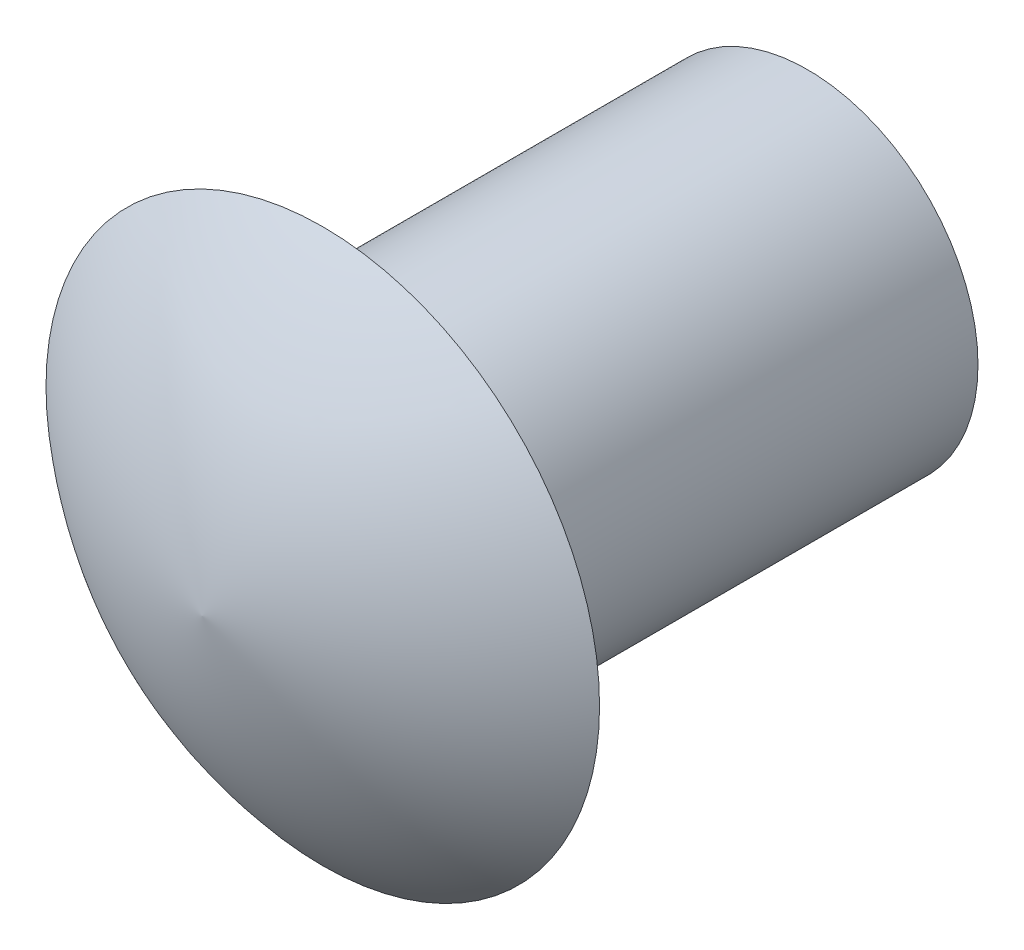
ISO-10303-21;
HEADER;
FILE_DESCRIPTION(('STEP AP214'),'2;1');
FILE_NAME('part.step','',(''),(''),'','','');
FILE_SCHEMA(('AUTOMOTIVE_DESIGN { 1 0 10303 214 1 1 1 1 }'));
ENDSEC;
DATA;
#1=APPLICATION_CONTEXT('core data for automotive mechanical design processes');
#2=APPLICATION_PROTOCOL_DEFINITION('international standard','automotive_design',2000,#1);
#3=PRODUCT_CONTEXT('',#1,'mechanical');
#4=PRODUCT('Part','Part','',(#3));
#5=PRODUCT_RELATED_PRODUCT_CATEGORY('part','',(#4));
#6=PRODUCT_DEFINITION_FORMATION('','',#4);
#7=PRODUCT_DEFINITION_CONTEXT('part definition',#1,'design');
#8=PRODUCT_DEFINITION('design','',#6,#7);
#9=PRODUCT_DEFINITION_SHAPE('','',#8);
#10=(LENGTH_UNIT() NAMED_UNIT(*) SI_UNIT(.MILLI.,.METRE.));
#11=(NAMED_UNIT(*) PLANE_ANGLE_UNIT() SI_UNIT($,.RADIAN.));
#12=(NAMED_UNIT(*) SI_UNIT($,.STERADIAN.) SOLID_ANGLE_UNIT());
#13=UNCERTAINTY_MEASURE_WITH_UNIT(LENGTH_MEASURE(1.E-05),#10,'distance_accuracy_value','');
#14=(GEOMETRIC_REPRESENTATION_CONTEXT(3) GLOBAL_UNCERTAINTY_ASSIGNED_CONTEXT((#13)) GLOBAL_UNIT_ASSIGNED_CONTEXT((#10,
#11,#12)) REPRESENTATION_CONTEXT('',''));
#15=CARTESIAN_POINT('',(0.,0.,0.));
#16=DIRECTION('',(0.,0.,1.));
#17=DIRECTION('',(1.,0.,0.));
#18=AXIS2_PLACEMENT_3D('',#15,#16,#17);
#19=CARTESIAN_POINT('',(0.,0.,-31.75));
#20=DIRECTION('',(0.,0.,1.));
#21=DIRECTION('',(1.,0.,0.));
#22=AXIS2_PLACEMENT_3D('',#19,#20,#21);
#23=CYLINDRICAL_SURFACE('',#22,11.16457);
#24=CARTESIAN_POINT('',(0.,0.,-31.75));
#25=DIRECTION('',(0.,0.,1.));
#26=DIRECTION('',(1.,0.,0.));
#27=AXIS2_PLACEMENT_3D('',#24,#25,#26);
#28=CIRCLE('',#27,11.16457);
#29=CARTESIAN_POINT('',(11.16457,0.,-31.75));
#30=VERTEX_POINT('',#29);
#31=EDGE_CURVE('E11',#30,#30,#28,.T.);
#32=ORIENTED_EDGE('',*,*,#31,.T.);
#33=EDGE_LOOP('',(#32));
#34=FACE_BOUND('',#33,.T.);
#35=CARTESIAN_POINT('',(0.,0.,0.));
#36=DIRECTION('',(0.,0.,1.));
#37=DIRECTION('',(1.,0.,0.));
#38=AXIS2_PLACEMENT_3D('',#35,#36,#37);
#39=CIRCLE('',#38,11.16457);
#40=CARTESIAN_POINT('',(11.16457,0.,0.));
#41=VERTEX_POINT('',#40);
#42=EDGE_CURVE('E36',#41,#41,#39,.T.);
#43=ORIENTED_EDGE('',*,*,#42,.F.);
#44=EDGE_LOOP('',(#43));
#45=FACE_BOUND('',#44,.T.);
#46=ADVANCED_FACE('F33',(#34,#45),#23,.T.);
#47=CARTESIAN_POINT('',(0.,0.,-31.75));
#48=DIRECTION('',(0.,0.,1.));
#49=DIRECTION('',(1.,0.,0.));
#50=AXIS2_PLACEMENT_3D('',#47,#48,#49);
#51=PLANE('',#50);
#52=ORIENTED_EDGE('',*,*,#31,.F.);
#53=EDGE_LOOP('',(#52));
#54=FACE_BOUND('',#53,.T.);
#55=ADVANCED_FACE('F57',(#54),#51,.F.);
#56=CARTESIAN_POINT('',(0.,0.,0.));
#57=DIRECTION('',(0.,0.,-1.));
#58=DIRECTION('',(-1.,0.,0.));
#59=AXIS2_PLACEMENT_3D('',#56,#57,#58);
#60=PLANE('',#59);
#61=ORIENTED_EDGE('',*,*,#42,.T.);
#62=EDGE_LOOP('',(#61));
#63=FACE_BOUND('',#62,.T.);
#64=CARTESIAN_POINT('',(0.,0.,0.));
#65=DIRECTION('',(0.,0.,-1.));
#66=DIRECTION('',(-1.,0.,0.));
#67=AXIS2_PLACEMENT_3D('',#64,#65,#66);
#68=CIRCLE('',#67,18.1281476547752);
#69=CARTESIAN_POINT('',(-18.1281476547752,0.,0.));
#70=VERTEX_POINT('',#69);
#71=EDGE_CURVE('E49',#70,#70,#68,.T.);
#72=ORIENTED_EDGE('',*,*,#71,.T.);
#73=EDGE_LOOP('',(#72));
#74=FACE_BOUND('',#73,.T.);
#75=ADVANCED_FACE('F45',(#63,#74),#60,.T.);
#76=CARTESIAN_POINT('',(3.69917091615607,0.,-25.3361712665129));
#77=DIRECTION('',(0.,-1.,0.));
#78=DIRECTION('',(-1.,0.,0.));
#79=AXIS2_PLACEMENT_3D('',#76,#77,#78);
#80=CIRCLE('',#79,33.4417913761059);
#81=TRIMMED_CURVE('',#80,(PARAMETER_VALUE(-1.45995428520228)),
(PARAMETER_VALUE(1.45995428520228)),.T.,.PARAMETER.);
#82=CARTESIAN_POINT('',(0.,0.,-25.3361712665129));
#83=DIRECTION('',(0.,0.,-1.));
#84=AXIS1_PLACEMENT('',#82,#83);
#85=SURFACE_OF_REVOLUTION('',#81,#84);
#86=CARTESIAN_POINT('',(0.,0.,7.90039812589072));
#87=VERTEX_POINT('',#86);
#88=VERTEX_LOOP('',#87);
#89=FACE_BOUND('',#88,.T.);
#90=ORIENTED_EDGE('',*,*,#71,.F.);
#91=EDGE_LOOP('',(#90));
#92=FACE_BOUND('',#91,.T.);
#93=ADVANCED_FACE('F42',(#89,#92),#85,.T.);
#94=CLOSED_SHELL('',(#46,#55,#75,#93));
#95=MANIFOLD_SOLID_BREP('B2',#94);
#96=ADVANCED_BREP_SHAPE_REPRESENTATION('',(#18,#95),#14);
#97=SHAPE_DEFINITION_REPRESENTATION(#9,#96);
ENDSEC;
END-ISO-10303-21;
